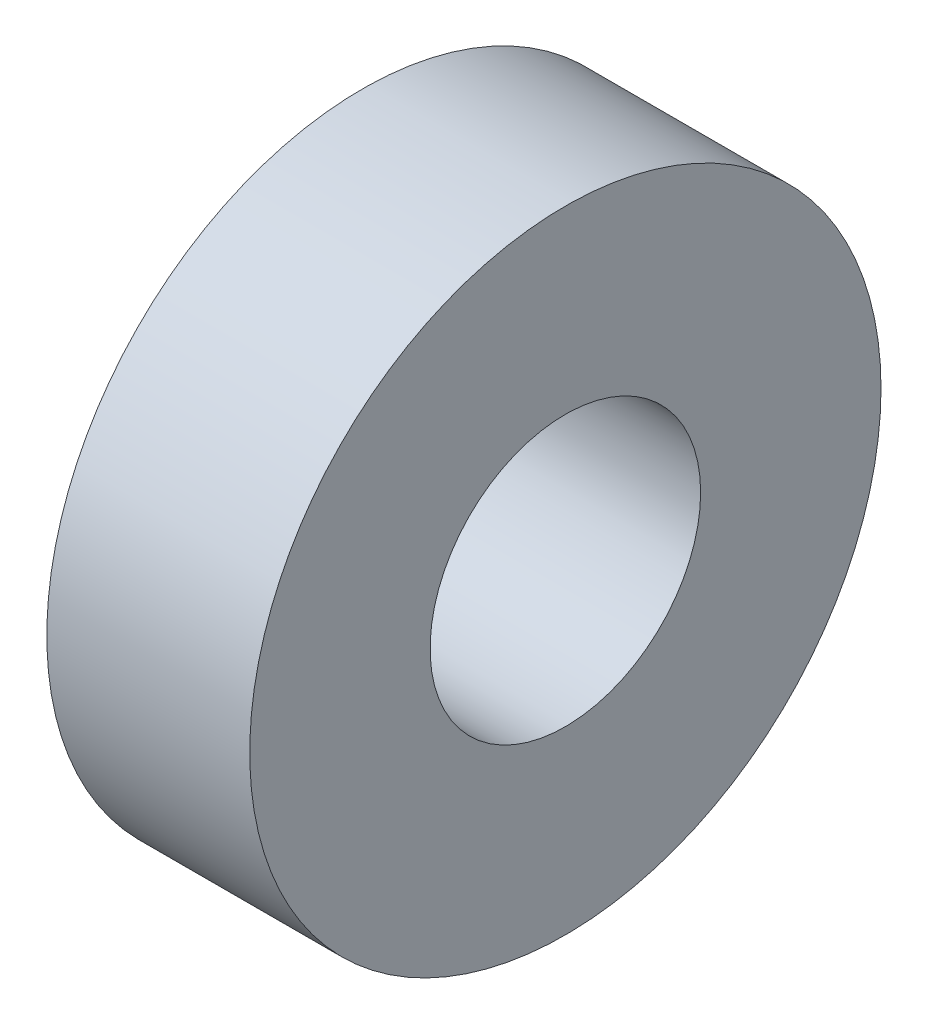
ISO-10303-21;
HEADER;
FILE_DESCRIPTION(('STEP AP214'),'2;1');
FILE_NAME('part.step','',(''),(''),'','','');
FILE_SCHEMA(('AUTOMOTIVE_DESIGN { 1 0 10303 214 1 1 1 1 }'));
ENDSEC;
DATA;
#1=APPLICATION_CONTEXT('core data for automotive mechanical design processes');
#2=APPLICATION_PROTOCOL_DEFINITION('international standard','automotive_design',2000,#1);
#3=PRODUCT_CONTEXT('',#1,'mechanical');
#4=PRODUCT('Part','Part','',(#3));
#5=PRODUCT_RELATED_PRODUCT_CATEGORY('part','',(#4));
#6=PRODUCT_DEFINITION_FORMATION('','',#4);
#7=PRODUCT_DEFINITION_CONTEXT('part definition',#1,'design');
#8=PRODUCT_DEFINITION('design','',#6,#7);
#9=PRODUCT_DEFINITION_SHAPE('','',#8);
#10=(LENGTH_UNIT() NAMED_UNIT(*) SI_UNIT(.MILLI.,.METRE.));
#11=(NAMED_UNIT(*) PLANE_ANGLE_UNIT() SI_UNIT($,.RADIAN.));
#12=(NAMED_UNIT(*) SI_UNIT($,.STERADIAN.) SOLID_ANGLE_UNIT());
#13=UNCERTAINTY_MEASURE_WITH_UNIT(LENGTH_MEASURE(1.E-05),#10,'distance_accuracy_value','');
#14=(GEOMETRIC_REPRESENTATION_CONTEXT(3) GLOBAL_UNCERTAINTY_ASSIGNED_CONTEXT((#13)) GLOBAL_UNIT_ASSIGNED_CONTEXT((#10,
#11,#12)) REPRESENTATION_CONTEXT('',''));
#15=CARTESIAN_POINT('',(0.,0.,0.));
#16=DIRECTION('',(0.,0.,1.));
#17=DIRECTION('',(1.,0.,0.));
#18=AXIS2_PLACEMENT_3D('',#15,#16,#17);
#19=CARTESIAN_POINT('',(28.575,0.,0.));
#20=DIRECTION('',(1.,0.,0.));
#21=DIRECTION('',(0.,0.,-1.));
#22=AXIS2_PLACEMENT_3D('',#19,#20,#21);
#23=PLANE('',#22);
#24=CARTESIAN_POINT('',(28.575,0.,0.));
#25=DIRECTION('',(1.,0.,0.));
#26=DIRECTION('',(0.,0.,-1.));
#27=AXIS2_PLACEMENT_3D('',#24,#25,#26);
#28=CIRCLE('',#27,88.9);
#29=CARTESIAN_POINT('',(28.575,0.,-88.9));
#30=VERTEX_POINT('',#29);
#31=EDGE_CURVE('E10',#30,#30,#28,.T.);
#32=ORIENTED_EDGE('',*,*,#31,.T.);
#33=EDGE_LOOP('',(#32));
#34=FACE_BOUND('',#33,.T.);
#35=CARTESIAN_POINT('',(28.575,0.,0.));
#36=DIRECTION('',(1.,0.,0.));
#37=DIRECTION('',(0.,0.,-1.));
#38=AXIS2_PLACEMENT_3D('',#35,#36,#37);
#39=CIRCLE('',#38,38.1);
#40=CARTESIAN_POINT('',(28.575,0.,-38.1));
#41=VERTEX_POINT('',#40);
#42=EDGE_CURVE('E54',#41,#41,#39,.T.);
#43=ORIENTED_EDGE('',*,*,#42,.F.);
#44=EDGE_LOOP('',(#43));
#45=FACE_BOUND('',#44,.T.);
#46=ADVANCED_FACE('F41',(#34,#45),#23,.T.);
#47=CARTESIAN_POINT('',(-28.575,0.,0.));
#48=DIRECTION('',(1.,0.,0.));
#49=DIRECTION('',(0.,0.,-1.));
#50=AXIS2_PLACEMENT_3D('',#47,#48,#49);
#51=PLANE('',#50);
#52=CARTESIAN_POINT('',(-28.575,0.,0.));
#53=DIRECTION('',(1.,0.,0.));
#54=DIRECTION('',(0.,0.,-1.));
#55=AXIS2_PLACEMENT_3D('',#52,#53,#54);
#56=CIRCLE('',#55,88.9);
#57=CARTESIAN_POINT('',(-28.575,0.,-88.9));
#58=VERTEX_POINT('',#57);
#59=EDGE_CURVE('E45',#58,#58,#56,.T.);
#60=ORIENTED_EDGE('',*,*,#59,.F.);
#61=EDGE_LOOP('',(#60));
#62=FACE_BOUND('',#61,.T.);
#63=CARTESIAN_POINT('',(-28.575,0.,0.));
#64=DIRECTION('',(1.,0.,0.));
#65=DIRECTION('',(0.,0.,-1.));
#66=AXIS2_PLACEMENT_3D('',#63,#64,#65);
#67=CIRCLE('',#66,38.1);
#68=CARTESIAN_POINT('',(-28.575,0.,-38.1));
#69=VERTEX_POINT('',#68);
#70=EDGE_CURVE('E56',#69,#69,#67,.T.);
#71=ORIENTED_EDGE('',*,*,#70,.T.);
#72=EDGE_LOOP('',(#71));
#73=FACE_BOUND('',#72,.T.);
#74=ADVANCED_FACE('F68',(#62,#73),#51,.F.);
#75=CARTESIAN_POINT('',(28.575,0.,0.));
#76=DIRECTION('',(-1.,0.,0.));
#77=DIRECTION('',(0.,0.,1.));
#78=AXIS2_PLACEMENT_3D('',#75,#76,#77);
#79=CYLINDRICAL_SURFACE('',#78,88.9);
#80=ORIENTED_EDGE('',*,*,#31,.F.);
#81=EDGE_LOOP('',(#80));
#82=FACE_BOUND('',#81,.T.);
#83=ORIENTED_EDGE('',*,*,#59,.T.);
#84=EDGE_LOOP('',(#83));
#85=FACE_BOUND('',#84,.T.);
#86=ADVANCED_FACE('F43',(#82,#85),#79,.T.);
#87=CARTESIAN_POINT('',(28.575,0.,0.));
#88=DIRECTION('',(-1.,0.,0.));
#89=DIRECTION('',(0.,0.,1.));
#90=AXIS2_PLACEMENT_3D('',#87,#88,#89);
#91=CYLINDRICAL_SURFACE('',#90,38.1);
#92=ORIENTED_EDGE('',*,*,#42,.T.);
#93=EDGE_LOOP('',(#92));
#94=FACE_BOUND('',#93,.T.);
#95=ORIENTED_EDGE('',*,*,#70,.F.);
#96=EDGE_LOOP('',(#95));
#97=FACE_BOUND('',#96,.T.);
#98=ADVANCED_FACE('F64',(#94,#97),#91,.F.);
#99=CLOSED_SHELL('',(#46,#74,#86,#98));
#100=MANIFOLD_SOLID_BREP('B2',#99);
#101=ADVANCED_BREP_SHAPE_REPRESENTATION('',(#18,#100),#14);
#102=SHAPE_DEFINITION_REPRESENTATION(#9,#101);
ENDSEC;
END-ISO-10303-21;
